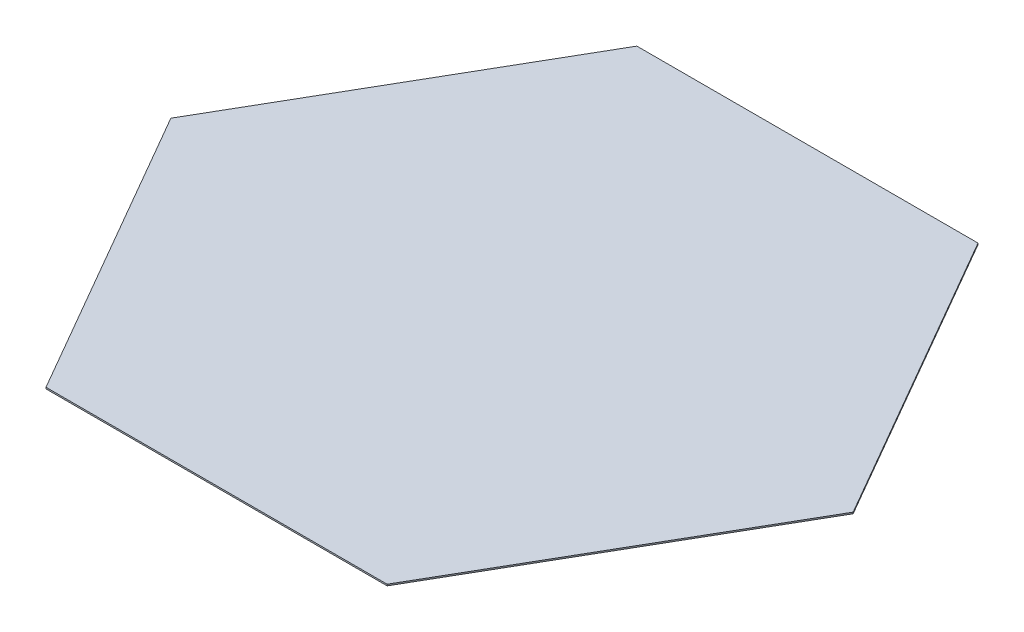
ISO-10303-21;
HEADER;
FILE_DESCRIPTION(('STEP AP214'),'2;1');
FILE_NAME('part.step','',(''),(''),'','','');
FILE_SCHEMA(('AUTOMOTIVE_DESIGN { 1 0 10303 214 1 1 1 1 }'));
ENDSEC;
DATA;
#1=APPLICATION_CONTEXT('core data for automotive mechanical design processes');
#2=APPLICATION_PROTOCOL_DEFINITION('international standard','automotive_design',2000,#1);
#3=PRODUCT_CONTEXT('',#1,'mechanical');
#4=PRODUCT('Part','Part','',(#3));
#5=PRODUCT_RELATED_PRODUCT_CATEGORY('part','',(#4));
#6=PRODUCT_DEFINITION_FORMATION('','',#4);
#7=PRODUCT_DEFINITION_CONTEXT('part definition',#1,'design');
#8=PRODUCT_DEFINITION('design','',#6,#7);
#9=PRODUCT_DEFINITION_SHAPE('','',#8);
#10=(LENGTH_UNIT() NAMED_UNIT(*) SI_UNIT(.MILLI.,.METRE.));
#11=(NAMED_UNIT(*) PLANE_ANGLE_UNIT() SI_UNIT($,.RADIAN.));
#12=(NAMED_UNIT(*) SI_UNIT($,.STERADIAN.) SOLID_ANGLE_UNIT());
#13=UNCERTAINTY_MEASURE_WITH_UNIT(LENGTH_MEASURE(1.E-05),#10,'distance_accuracy_value','');
#14=(GEOMETRIC_REPRESENTATION_CONTEXT(3) GLOBAL_UNCERTAINTY_ASSIGNED_CONTEXT((#13)) GLOBAL_UNIT_ASSIGNED_CONTEXT((#10,
#11,#12)) REPRESENTATION_CONTEXT('',''));
#15=CARTESIAN_POINT('',(0.,0.,0.));
#16=DIRECTION('',(0.,0.,1.));
#17=DIRECTION('',(1.,0.,0.));
#18=AXIS2_PLACEMENT_3D('',#15,#16,#17);
#19=CARTESIAN_POINT('',(577.350269189638,5.,999.999999999994));
#20=DIRECTION('',(-0.866025403784442,0.,-0.499999999999995));
#21=DIRECTION('',(-0.499999999999995,0.,0.866025403784442));
#22=AXIS2_PLACEMENT_3D('',#19,#20,#21);
#23=PLANE('',#22);
#24=DIRECTION('',(0.499999999999995,0.,-0.866025403784441));
#25=VECTOR('',#24,1.);
#26=CARTESIAN_POINT('',(577.350269189638,0.,999.999999999994));
#27=LINE('',#26,#25);
#28=CARTESIAN_POINT('',(577.350269189638,0.,999.999999999994));
#29=VERTEX_POINT('',#28);
#30=CARTESIAN_POINT('',(1154.70053837925,0.,0.));
#31=VERTEX_POINT('',#30);
#32=EDGE_CURVE('E128',#29,#31,#27,.T.);
#33=ORIENTED_EDGE('',*,*,#32,.T.);
#34=DIRECTION('',(0.,-1.,0.));
#35=VECTOR('',#34,1.);
#36=CARTESIAN_POINT('',(1154.70053837925,5.,0.));
#37=LINE('',#36,#35);
#38=CARTESIAN_POINT('',(1154.70053837925,5.,0.));
#39=VERTEX_POINT('',#38);
#40=EDGE_CURVE('E11',#39,#31,#37,.T.);
#41=ORIENTED_EDGE('',*,*,#40,.F.);
#42=DIRECTION('',(0.499999999999995,0.,-0.866025403784441));
#43=VECTOR('',#42,1.);
#44=CARTESIAN_POINT('',(577.350269189638,5.,999.999999999994));
#45=LINE('',#44,#43);
#46=CARTESIAN_POINT('',(577.350269189638,5.,999.999999999994));
#47=VERTEX_POINT('',#46);
#48=EDGE_CURVE('E144',#47,#39,#45,.T.);
#49=ORIENTED_EDGE('',*,*,#48,.F.);
#50=DIRECTION('',(0.,-1.,0.));
#51=VECTOR('',#50,1.);
#52=CARTESIAN_POINT('',(577.350269189638,5.,999.999999999994));
#53=LINE('',#52,#51);
#54=EDGE_CURVE('E124',#47,#29,#53,.T.);
#55=ORIENTED_EDGE('',*,*,#54,.T.);
#56=EDGE_LOOP('',(#33,#41,#49,#55));
#57=FACE_BOUND('',#56,.T.);
#58=ADVANCED_FACE('F39',(#57),#23,.F.);
#59=CARTESIAN_POINT('',(1154.70053837925,5.,0.));
#60=DIRECTION('',(-0.866025403784438,0.,0.500000000000001));
#61=DIRECTION('',(0.500000000000001,0.,0.866025403784438));
#62=AXIS2_PLACEMENT_3D('',#59,#60,#61);
#63=PLANE('',#62);
#64=DIRECTION('',(-0.500000000000001,0.,-0.866025403784438));
#65=VECTOR('',#64,1.);
#66=CARTESIAN_POINT('',(1154.70053837925,0.,0.));
#67=LINE('',#66,#65);
#68=CARTESIAN_POINT('',(577.350269189624,0.,-1000.));
#69=VERTEX_POINT('',#68);
#70=EDGE_CURVE('E132',#31,#69,#67,.T.);
#71=ORIENTED_EDGE('',*,*,#70,.T.);
#72=DIRECTION('',(0.,-1.,0.));
#73=VECTOR('',#72,1.);
#74=CARTESIAN_POINT('',(577.350269189624,5.,-1000.));
#75=LINE('',#74,#73);
#76=CARTESIAN_POINT('',(577.350269189624,5.,-1000.));
#77=VERTEX_POINT('',#76);
#78=EDGE_CURVE('E48',#77,#69,#75,.T.);
#79=ORIENTED_EDGE('',*,*,#78,.F.);
#80=DIRECTION('',(-0.500000000000001,0.,-0.866025403784438));
#81=VECTOR('',#80,1.);
#82=CARTESIAN_POINT('',(1154.70053837925,5.,0.));
#83=LINE('',#82,#81);
#84=EDGE_CURVE('E93',#39,#77,#83,.T.);
#85=ORIENTED_EDGE('',*,*,#84,.F.);
#86=ORIENTED_EDGE('',*,*,#40,.T.);
#87=EDGE_LOOP('',(#71,#79,#85,#86));
#88=FACE_BOUND('',#87,.T.);
#89=ADVANCED_FACE('F172',(#88),#63,.F.);
#90=CARTESIAN_POINT('',(577.350269189624,5.,-1000.));
#91=DIRECTION('',(0.,0.,1.));
#92=DIRECTION('',(1.,0.,0.));
#93=AXIS2_PLACEMENT_3D('',#90,#91,#92);
#94=PLANE('',#93);
#95=DIRECTION('',(-1.,0.,0.));
#96=VECTOR('',#95,1.);
#97=CARTESIAN_POINT('',(577.350269189624,0.,-1000.));
#98=LINE('',#97,#96);
#99=CARTESIAN_POINT('',(-577.350269189631,0.,-999.999999999998));
#100=VERTEX_POINT('',#99);
#101=EDGE_CURVE('E135',#69,#100,#98,.T.);
#102=ORIENTED_EDGE('',*,*,#101,.T.);
#103=DIRECTION('',(0.,-1.,0.));
#104=VECTOR('',#103,1.);
#105=CARTESIAN_POINT('',(-577.350269189631,5.,-999.999999999998));
#106=LINE('',#105,#104);
#107=CARTESIAN_POINT('',(-577.350269189631,5.,-999.999999999998));
#108=VERTEX_POINT('',#107);
#109=EDGE_CURVE('E117',#108,#100,#106,.T.);
#110=ORIENTED_EDGE('',*,*,#109,.F.);
#111=DIRECTION('',(-1.,0.,0.));
#112=VECTOR('',#111,1.);
#113=CARTESIAN_POINT('',(577.350269189624,5.,-1000.));
#114=LINE('',#113,#112);
#115=EDGE_CURVE('E106',#77,#108,#114,.T.);
#116=ORIENTED_EDGE('',*,*,#115,.F.);
#117=ORIENTED_EDGE('',*,*,#78,.T.);
#118=EDGE_LOOP('',(#102,#110,#116,#117));
#119=FACE_BOUND('',#118,.T.);
#120=ADVANCED_FACE('F154',(#119),#94,.F.);
#121=CARTESIAN_POINT('',(-577.350269189631,5.,-999.999999999998));
#122=DIRECTION('',(0.866025403784442,0.,0.499999999999995));
#123=DIRECTION('',(0.499999999999995,0.,-0.866025403784442));
#124=AXIS2_PLACEMENT_3D('',#121,#122,#123);
#125=PLANE('',#124);
#126=DIRECTION('',(-0.499999999999995,0.,0.866025403784442));
#127=VECTOR('',#126,1.);
#128=CARTESIAN_POINT('',(-577.350269189631,0.,-999.999999999998));
#129=LINE('',#128,#127);
#130=CARTESIAN_POINT('',(-1154.70053837925,0.,8.06323076340656E-12));
#131=VERTEX_POINT('',#130);
#132=EDGE_CURVE('E115',#100,#131,#129,.T.);
#133=ORIENTED_EDGE('',*,*,#132,.T.);
#134=DIRECTION('',(0.,-1.,0.));
#135=VECTOR('',#134,1.);
#136=CARTESIAN_POINT('',(-1154.70053837925,5.,8.06323076340656E-12));
#137=LINE('',#136,#135);
#138=CARTESIAN_POINT('',(-1154.70053837925,5.,8.06323076340656E-12));
#139=VERTEX_POINT('',#138);
#140=EDGE_CURVE('E112',#139,#131,#137,.T.);
#141=ORIENTED_EDGE('',*,*,#140,.F.);
#142=DIRECTION('',(-0.499999999999995,0.,0.866025403784442));
#143=VECTOR('',#142,1.);
#144=CARTESIAN_POINT('',(-577.350269189631,5.,-999.999999999998));
#145=LINE('',#144,#143);
#146=EDGE_CURVE('E100',#108,#139,#145,.T.);
#147=ORIENTED_EDGE('',*,*,#146,.F.);
#148=ORIENTED_EDGE('',*,*,#109,.T.);
#149=EDGE_LOOP('',(#133,#141,#147,#148));
#150=FACE_BOUND('',#149,.T.);
#151=ADVANCED_FACE('F113',(#150),#125,.F.);
#152=CARTESIAN_POINT('',(-1154.70053837925,5.,8.06323076340656E-12));
#153=DIRECTION('',(0.866025403784434,0.,-0.500000000000007));
#154=DIRECTION('',(-0.500000000000007,0.,-0.866025403784435));
#155=AXIS2_PLACEMENT_3D('',#152,#153,#154);
#156=PLANE('',#155);
#157=DIRECTION('',(0.500000000000007,0.,0.866025403784434));
#158=VECTOR('',#157,1.);
#159=CARTESIAN_POINT('',(-1154.70053837925,0.,8.06323076340656E-12));
#160=LINE('',#159,#158);
#161=CARTESIAN_POINT('',(-577.350269189617,0.,1000.00000000001));
#162=VERTEX_POINT('',#161);
#163=EDGE_CURVE('E79',#131,#162,#160,.T.);
#164=ORIENTED_EDGE('',*,*,#163,.T.);
#165=DIRECTION('',(0.,-1.,0.));
#166=VECTOR('',#165,1.);
#167=CARTESIAN_POINT('',(-577.350269189617,5.,1000.00000000001));
#168=LINE('',#167,#166);
#169=CARTESIAN_POINT('',(-577.350269189617,5.,1000.00000000001));
#170=VERTEX_POINT('',#169);
#171=EDGE_CURVE('E118',#170,#162,#168,.T.);
#172=ORIENTED_EDGE('',*,*,#171,.F.);
#173=DIRECTION('',(0.500000000000007,0.,0.866025403784434));
#174=VECTOR('',#173,1.);
#175=CARTESIAN_POINT('',(-1154.70053837925,5.,8.06323076340656E-12));
#176=LINE('',#175,#174);
#177=EDGE_CURVE('E104',#139,#170,#176,.T.);
#178=ORIENTED_EDGE('',*,*,#177,.F.);
#179=ORIENTED_EDGE('',*,*,#140,.T.);
#180=EDGE_LOOP('',(#164,#172,#178,#179));
#181=FACE_BOUND('',#180,.T.);
#182=ADVANCED_FACE('F120',(#181),#156,.F.);
#183=CARTESIAN_POINT('',(-577.350269189617,5.,1000.00000000001));
#184=DIRECTION('',(0.,0.,-1.));
#185=DIRECTION('',(-1.,0.,0.));
#186=AXIS2_PLACEMENT_3D('',#183,#184,#185);
#187=PLANE('',#186);
#188=DIRECTION('',(1.,0.,0.));
#189=VECTOR('',#188,1.);
#190=CARTESIAN_POINT('',(-577.350269189617,0.,1000.00000000001));
#191=LINE('',#190,#189);
#192=EDGE_CURVE('E85',#162,#29,#191,.T.);
#193=ORIENTED_EDGE('',*,*,#192,.T.);
#194=ORIENTED_EDGE('',*,*,#54,.F.);
#195=DIRECTION('',(1.,0.,0.));
#196=VECTOR('',#195,1.);
#197=CARTESIAN_POINT('',(-577.350269189617,5.,1000.00000000001));
#198=LINE('',#197,#196);
#199=EDGE_CURVE('E56',#170,#47,#198,.T.);
#200=ORIENTED_EDGE('',*,*,#199,.F.);
#201=ORIENTED_EDGE('',*,*,#171,.T.);
#202=EDGE_LOOP('',(#193,#194,#200,#201));
#203=FACE_BOUND('',#202,.T.);
#204=ADVANCED_FACE('F161',(#203),#187,.F.);
#205=CARTESIAN_POINT('',(0.,5.,0.));
#206=DIRECTION('',(0.,1.,0.));
#207=DIRECTION('',(0.,0.,1.));
#208=AXIS2_PLACEMENT_3D('',#205,#206,#207);
#209=PLANE('',#208);
#210=ORIENTED_EDGE('',*,*,#48,.T.);
#211=ORIENTED_EDGE('',*,*,#84,.T.);
#212=ORIENTED_EDGE('',*,*,#115,.T.);
#213=ORIENTED_EDGE('',*,*,#146,.T.);
#214=ORIENTED_EDGE('',*,*,#177,.T.);
#215=ORIENTED_EDGE('',*,*,#199,.T.);
#216=EDGE_LOOP('',(#210,#211,#212,#213,#214,#215));
#217=FACE_BOUND('',#216,.T.);
#218=ADVANCED_FACE('F102',(#217),#209,.T.);
#219=CARTESIAN_POINT('',(0.,0.,0.));
#220=DIRECTION('',(0.,1.,0.));
#221=DIRECTION('',(0.,0.,1.));
#222=AXIS2_PLACEMENT_3D('',#219,#220,#221);
#223=PLANE('',#222);
#224=ORIENTED_EDGE('',*,*,#32,.F.);
#225=ORIENTED_EDGE('',*,*,#192,.F.);
#226=ORIENTED_EDGE('',*,*,#163,.F.);
#227=ORIENTED_EDGE('',*,*,#132,.F.);
#228=ORIENTED_EDGE('',*,*,#101,.F.);
#229=ORIENTED_EDGE('',*,*,#70,.F.);
#230=EDGE_LOOP('',(#224,#225,#226,#227,#228,#229));
#231=FACE_BOUND('',#230,.T.);
#232=ADVANCED_FACE('F157',(#231),#223,.F.);
#233=CLOSED_SHELL('',(#58,#89,#120,#151,#182,#204,#218,#232));
#234=MANIFOLD_SOLID_BREP('B2',#233);
#235=ADVANCED_BREP_SHAPE_REPRESENTATION('',(#18,#234),#14);
#236=SHAPE_DEFINITION_REPRESENTATION(#9,#235);
ENDSEC;
END-ISO-10303-21;
